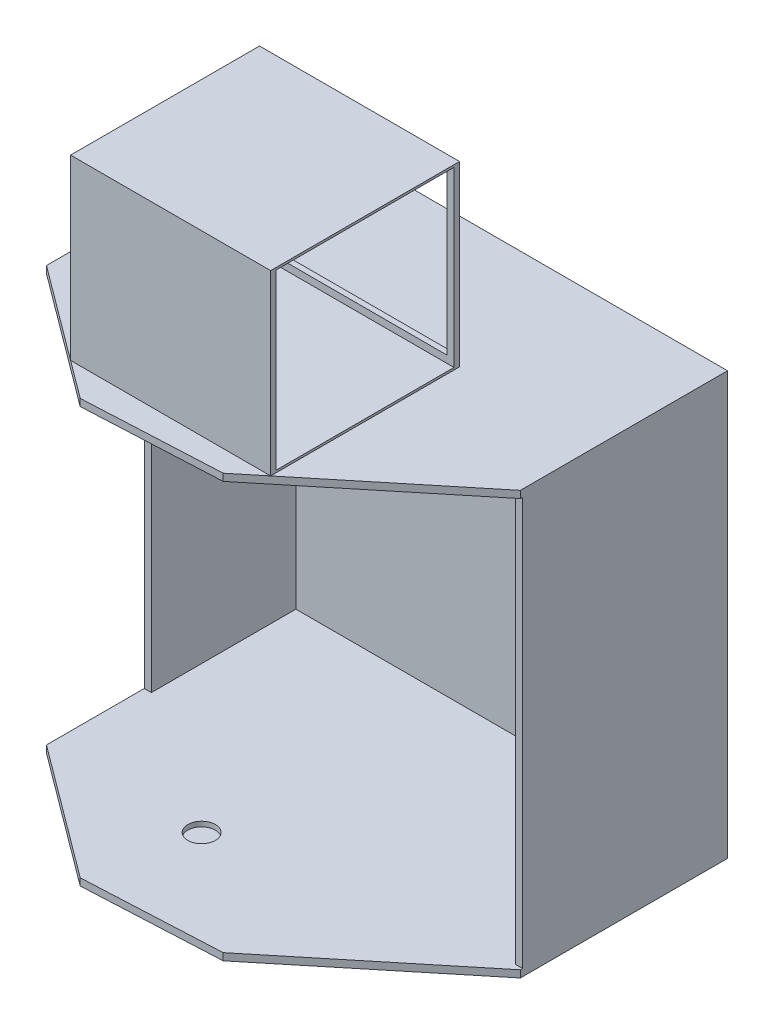
ISO-10303-21;
HEADER;
FILE_DESCRIPTION(('STEP AP214'),'2;1');
FILE_NAME('part.step','',(''),(''),'','','');
FILE_SCHEMA(('AUTOMOTIVE_DESIGN { 1 0 10303 214 1 1 1 1 }'));
ENDSEC;
DATA;
#1=APPLICATION_CONTEXT('core data for automotive mechanical design processes');
#2=APPLICATION_PROTOCOL_DEFINITION('international standard','automotive_design',2000,#1);
#3=PRODUCT_CONTEXT('',#1,'mechanical');
#4=PRODUCT('Part','Part','',(#3));
#5=PRODUCT_RELATED_PRODUCT_CATEGORY('part','',(#4));
#6=PRODUCT_DEFINITION_FORMATION('','',#4);
#7=PRODUCT_DEFINITION_CONTEXT('part definition',#1,'design');
#8=PRODUCT_DEFINITION('design','',#6,#7);
#9=PRODUCT_DEFINITION_SHAPE('','',#8);
#10=(LENGTH_UNIT() NAMED_UNIT(*) SI_UNIT(.MILLI.,.METRE.));
#11=(NAMED_UNIT(*) PLANE_ANGLE_UNIT() SI_UNIT($,.RADIAN.));
#12=(NAMED_UNIT(*) SI_UNIT($,.STERADIAN.) SOLID_ANGLE_UNIT());
#13=UNCERTAINTY_MEASURE_WITH_UNIT(LENGTH_MEASURE(1.E-05),#10,'distance_accuracy_value','');
#14=(GEOMETRIC_REPRESENTATION_CONTEXT(3) GLOBAL_UNCERTAINTY_ASSIGNED_CONTEXT((#13)) GLOBAL_UNIT_ASSIGNED_CONTEXT((#10,
#11,#12)) REPRESENTATION_CONTEXT('',''));
#15=CARTESIAN_POINT('',(0.,0.,0.));
#16=DIRECTION('',(0.,0.,1.));
#17=DIRECTION('',(1.,0.,0.));
#18=AXIS2_PLACEMENT_3D('',#15,#16,#17);
#19=CARTESIAN_POINT('',(0.,190.,0.));
#20=DIRECTION('',(0.,-1.,0.));
#21=DIRECTION('',(0.,0.,-1.));
#22=AXIS2_PLACEMENT_3D('',#19,#20,#21);
#23=PLANE('',#22);
#24=DIRECTION('',(0.,0.,1.));
#25=VECTOR('',#24,1.);
#26=CARTESIAN_POINT('',(-31.9964301301994,190.,55.5581452343));
#27=LINE('',#26,#25);
#28=CARTESIAN_POINT('',(-31.9964301301994,190.,55.5581452343));
#29=VERTEX_POINT('',#28);
#30=CARTESIAN_POINT('',(-31.9964301301994,190.,140.5581452343));
#31=VERTEX_POINT('',#30);
#32=EDGE_CURVE('E283',#29,#31,#27,.T.);
#33=ORIENTED_EDGE('',*,*,#32,.F.);
#34=DIRECTION('',(-1.,0.,0.));
#35=VECTOR('',#34,1.);
#36=CARTESIAN_POINT('',(58.0035698698006,190.,55.5581452343));
#37=LINE('',#36,#35);
#38=CARTESIAN_POINT('',(58.0035698698006,190.,55.5581452343));
#39=VERTEX_POINT('',#38);
#40=EDGE_CURVE('E294',#39,#29,#37,.T.);
#41=ORIENTED_EDGE('',*,*,#40,.F.);
#42=DIRECTION('',(0.,0.,-1.));
#43=VECTOR('',#42,1.);
#44=CARTESIAN_POINT('',(58.0035698698006,190.,140.5581452343));
#45=LINE('',#44,#43);
#46=CARTESIAN_POINT('',(58.0035698698006,190.,140.5581452343));
#47=VERTEX_POINT('',#46);
#48=EDGE_CURVE('E306',#47,#39,#45,.T.);
#49=ORIENTED_EDGE('',*,*,#48,.F.);
#50=DIRECTION('',(0.773976601824276,0.,-0.633214197431285));
#51=VECTOR('',#50,1.);
#52=CARTESIAN_POINT('',(119.800702027798,190.,90.));
#53=LINE('',#52,#51);
#54=CARTESIAN_POINT('',(119.800702027798,190.,90.));
#55=VERTEX_POINT('',#54);
#56=EDGE_CURVE('E346',#47,#55,#53,.T.);
#57=ORIENTED_EDGE('',*,*,#56,.T.);
#58=DIRECTION('',(0.,0.,-1.));
#59=VECTOR('',#58,1.);
#60=CARTESIAN_POINT('',(119.800702027798,190.,89.));
#61=LINE('',#60,#59);
#62=CARTESIAN_POINT('',(119.800702027798,190.,-3.2));
#63=VERTEX_POINT('',#62);
#64=EDGE_CURVE('E393',#55,#63,#61,.T.);
#65=ORIENTED_EDGE('',*,*,#64,.T.);
#66=DIRECTION('',(-1.,0.,0.));
#67=VECTOR('',#66,1.);
#68=CARTESIAN_POINT('',(-74.3992979722016,190.,-3.2));
#69=LINE('',#68,#67);
#70=CARTESIAN_POINT('',(-74.3992979722016,190.,-3.2));
#71=VERTEX_POINT('',#70);
#72=EDGE_CURVE('E337',#63,#71,#69,.T.);
#73=ORIENTED_EDGE('',*,*,#72,.T.);
#74=DIRECTION('',(0.,0.,1.));
#75=VECTOR('',#74,1.);
#76=CARTESIAN_POINT('',(-74.3992979722016,190.,65.));
#77=LINE('',#76,#75);
#78=CARTESIAN_POINT('',(-74.3992979722016,190.,109.));
#79=VERTEX_POINT('',#78);
#80=EDGE_CURVE('E408',#71,#79,#77,.T.);
#81=ORIENTED_EDGE('',*,*,#80,.T.);
#82=DIRECTION('',(0.802210362931271,0.,0.597041483990583));
#83=VECTOR('',#82,1.);
#84=CARTESIAN_POINT('',(-15.0357311152875,190.,153.181069815303));
#85=LINE('',#84,#83);
#86=EDGE_CURVE('E351',#79,#31,#85,.T.);
#87=ORIENTED_EDGE('',*,*,#86,.T.);
#88=EDGE_LOOP('',(#33,#41,#49,#57,#65,#73,#81,#87));
#89=FACE_BOUND('',#88,.T.);
#90=ADVANCED_FACE('F33',(#89),#23,.F.);
#91=DIRECTION('',(1.,0.,0.));
#92=VECTOR('',#91,1.);
#93=CARTESIAN_POINT('',(-31.9964301301994,190.,140.5581452343));
#94=LINE('',#93,#92);
#95=EDGE_CURVE('E303',#31,#47,#94,.T.);
#96=ORIENTED_EDGE('',*,*,#95,.F.);
#97=CARTESIAN_POINT('',(-15.0357311152875,190.,153.181069815303));
#98=VERTEX_POINT('',#97);
#99=EDGE_CURVE('E378',#31,#98,#85,.T.);
#100=ORIENTED_EDGE('',*,*,#99,.T.);
#101=DIRECTION('',(0.998784397084784,0.,-0.0492922726193887));
#102=VECTOR('',#101,1.);
#103=CARTESIAN_POINT('',(46.2729248544923,190.,150.155348755972));
#104=LINE('',#103,#102);
#105=CARTESIAN_POINT('',(46.2729248544923,190.,150.155348755972));
#106=VERTEX_POINT('',#105);
#107=EDGE_CURVE('E375',#98,#106,#104,.T.);
#108=ORIENTED_EDGE('',*,*,#107,.T.);
#109=EDGE_CURVE('E372',#106,#47,#53,.T.);
#110=ORIENTED_EDGE('',*,*,#109,.T.);
#111=EDGE_LOOP('',(#96,#100,#108,#110));
#112=FACE_BOUND('',#111,.T.);
#113=ADVANCED_FACE('F575',(#112),#23,.F.);
#114=CARTESIAN_POINT('',(-71.1992979722016,190.,65.));
#115=DIRECTION('',(0.,0.,-1.));
#116=DIRECTION('',(-1.,0.,0.));
#117=AXIS2_PLACEMENT_3D('',#114,#115,#116);
#118=PLANE('',#117);
#119=DIRECTION('',(-1.,0.,0.));
#120=VECTOR('',#119,1.);
#121=CARTESIAN_POINT('',(-74.3992979722016,186.8,65.));
#122=LINE('',#121,#120);
#123=CARTESIAN_POINT('',(-71.1992979722016,186.8,65.));
#124=VERTEX_POINT('',#123);
#125=CARTESIAN_POINT('',(-74.3992979722016,186.8,65.));
#126=VERTEX_POINT('',#125);
#127=EDGE_CURVE('E368',#124,#126,#122,.T.);
#128=ORIENTED_EDGE('',*,*,#127,.T.);
#129=DIRECTION('',(0.,-1.,0.));
#130=VECTOR('',#129,1.);
#131=CARTESIAN_POINT('',(-74.3992979722016,190.,65.));
#132=LINE('',#131,#130);
#133=CARTESIAN_POINT('',(-74.3992979722016,3.2,65.));
#134=VERTEX_POINT('',#133);
#135=EDGE_CURVE('E410',#126,#134,#132,.T.);
#136=ORIENTED_EDGE('',*,*,#135,.T.);
#137=DIRECTION('',(-1.,0.,0.));
#138=VECTOR('',#137,1.);
#139=CARTESIAN_POINT('',(-74.3992979722016,3.2,65.));
#140=LINE('',#139,#138);
#141=CARTESIAN_POINT('',(-71.1992979722016,3.2,65.));
#142=VERTEX_POINT('',#141);
#143=EDGE_CURVE('E433',#142,#134,#140,.T.);
#144=ORIENTED_EDGE('',*,*,#143,.F.);
#145=DIRECTION('',(0.,-1.,0.));
#146=VECTOR('',#145,1.);
#147=CARTESIAN_POINT('',(-71.1992979722016,190.,65.));
#148=LINE('',#147,#146);
#149=EDGE_CURVE('E414',#124,#142,#148,.T.);
#150=ORIENTED_EDGE('',*,*,#149,.F.);
#151=EDGE_LOOP('',(#128,#136,#144,#150));
#152=FACE_BOUND('',#151,.T.);
#153=ADVANCED_FACE('F501',(#152),#118,.F.);
#154=CARTESIAN_POINT('',(-71.1992979722016,190.,0.));
#155=DIRECTION('',(-1.,0.,0.));
#156=DIRECTION('',(0.,0.,1.));
#157=AXIS2_PLACEMENT_3D('',#154,#155,#156);
#158=PLANE('',#157);
#159=DIRECTION('',(0.,0.,1.));
#160=VECTOR('',#159,1.);
#161=CARTESIAN_POINT('',(-71.1992979722016,186.8,65.));
#162=LINE('',#161,#160);
#163=CARTESIAN_POINT('',(-71.1992979722016,186.8,0.));
#164=VERTEX_POINT('',#163);
#165=EDGE_CURVE('E347',#164,#124,#162,.T.);
#166=ORIENTED_EDGE('',*,*,#165,.T.);
#167=ORIENTED_EDGE('',*,*,#149,.T.);
#168=DIRECTION('',(0.,0.,1.));
#169=VECTOR('',#168,1.);
#170=CARTESIAN_POINT('',(-71.1992979722016,3.2,65.));
#171=LINE('',#170,#169);
#172=CARTESIAN_POINT('',(-71.1992979722016,3.2,0.));
#173=VERTEX_POINT('',#172);
#174=EDGE_CURVE('E430',#173,#142,#171,.T.);
#175=ORIENTED_EDGE('',*,*,#174,.F.);
#176=DIRECTION('',(0.,-1.,0.));
#177=VECTOR('',#176,1.);
#178=CARTESIAN_POINT('',(-71.1992979722016,190.,0.));
#179=LINE('',#178,#177);
#180=EDGE_CURVE('E412',#164,#173,#179,.T.);
#181=ORIENTED_EDGE('',*,*,#180,.F.);
#182=EDGE_LOOP('',(#166,#167,#175,#181));
#183=FACE_BOUND('',#182,.T.);
#184=ADVANCED_FACE('F497',(#183),#158,.F.);
#185=CARTESIAN_POINT('',(116.600702027798,190.,0.));
#186=DIRECTION('',(1.,0.,0.));
#187=DIRECTION('',(0.,0.,-1.));
#188=AXIS2_PLACEMENT_3D('',#185,#186,#187);
#189=PLANE('',#188);
#190=DIRECTION('',(0.,0.,1.));
#191=VECTOR('',#190,1.);
#192=CARTESIAN_POINT('',(116.600702027798,186.8,0.));
#193=LINE('',#192,#191);
#194=CARTESIAN_POINT('',(116.600702027798,186.8,0.));
#195=VERTEX_POINT('',#194);
#196=CARTESIAN_POINT('',(116.600702027798,186.8,89.));
#197=VERTEX_POINT('',#196);
#198=EDGE_CURVE('E391',#195,#197,#193,.T.);
#199=ORIENTED_EDGE('',*,*,#198,.F.);
#200=DIRECTION('',(0.,-1.,0.));
#201=VECTOR('',#200,1.);
#202=CARTESIAN_POINT('',(116.600702027798,190.,0.));
#203=LINE('',#202,#201);
#204=CARTESIAN_POINT('',(116.600702027798,3.2,0.));
#205=VERTEX_POINT('',#204);
#206=EDGE_CURVE('E399',#195,#205,#203,.T.);
#207=ORIENTED_EDGE('',*,*,#206,.T.);
#208=DIRECTION('',(0.,0.,1.));
#209=VECTOR('',#208,1.);
#210=CARTESIAN_POINT('',(116.600702027798,3.2,0.));
#211=LINE('',#210,#209);
#212=CARTESIAN_POINT('',(116.600702027798,3.2,89.));
#213=VERTEX_POINT('',#212);
#214=EDGE_CURVE('E405',#205,#213,#211,.T.);
#215=ORIENTED_EDGE('',*,*,#214,.T.);
#216=DIRECTION('',(0.,-1.,0.));
#217=VECTOR('',#216,1.);
#218=CARTESIAN_POINT('',(116.600702027798,190.,89.));
#219=LINE('',#218,#217);
#220=EDGE_CURVE('E397',#197,#213,#219,.T.);
#221=ORIENTED_EDGE('',*,*,#220,.F.);
#222=EDGE_LOOP('',(#199,#207,#215,#221));
#223=FACE_BOUND('',#222,.T.);
#224=ADVANCED_FACE('F489',(#223),#189,.F.);
#225=CARTESIAN_POINT('',(116.600702027798,190.,89.));
#226=DIRECTION('',(0.,0.,-1.));
#227=DIRECTION('',(-1.,0.,0.));
#228=AXIS2_PLACEMENT_3D('',#225,#226,#227);
#229=PLANE('',#228);
#230=DIRECTION('',(1.,0.,0.));
#231=VECTOR('',#230,1.);
#232=CARTESIAN_POINT('',(116.600702027798,186.8,89.));
#233=LINE('',#232,#231);
#234=CARTESIAN_POINT('',(119.800702027798,186.8,89.));
#235=VERTEX_POINT('',#234);
#236=EDGE_CURVE('E42',#197,#235,#233,.T.);
#237=ORIENTED_EDGE('',*,*,#236,.F.);
#238=ORIENTED_EDGE('',*,*,#220,.T.);
#239=DIRECTION('',(1.,0.,0.));
#240=VECTOR('',#239,1.);
#241=CARTESIAN_POINT('',(0.,3.2,89.));
#242=LINE('',#241,#240);
#243=CARTESIAN_POINT('',(119.800702027798,3.20000000000001,89.));
#244=VERTEX_POINT('',#243);
#245=EDGE_CURVE('E402',#213,#244,#242,.T.);
#246=ORIENTED_EDGE('',*,*,#245,.T.);
#247=DIRECTION('',(0.,-1.,0.));
#248=VECTOR('',#247,1.);
#249=CARTESIAN_POINT('',(119.800702027798,190.,89.));
#250=LINE('',#249,#248);
#251=EDGE_CURVE('E395',#235,#244,#250,.T.);
#252=ORIENTED_EDGE('',*,*,#251,.F.);
#253=EDGE_LOOP('',(#237,#238,#246,#252));
#254=FACE_BOUND('',#253,.T.);
#255=ADVANCED_FACE('F483',(#254),#229,.F.);
#256=CARTESIAN_POINT('',(0.,3.2,0.));
#257=DIRECTION('',(0.,-1.,0.));
#258=DIRECTION('',(0.,0.,-1.));
#259=AXIS2_PLACEMENT_3D('',#256,#257,#258);
#260=PLANE('',#259);
#261=CARTESIAN_POINT('',(-5.39929797220156,3.2,108.199281836625));
#262=DIRECTION('',(0.,-1.,0.));
#263=DIRECTION('',(0.,0.,-1.));
#264=AXIS2_PLACEMENT_3D('',#261,#262,#263);
#265=CIRCLE('',#264,6.2);
#266=CARTESIAN_POINT('',(-5.39929797220156,3.2,101.999281836625));
#267=VERTEX_POINT('',#266);
#268=EDGE_CURVE('E331',#267,#267,#265,.T.);
#269=ORIENTED_EDGE('',*,*,#268,.T.);
#270=EDGE_LOOP('',(#269));
#271=FACE_BOUND('',#270,.T.);
#272=ORIENTED_EDGE('',*,*,#214,.F.);
#273=DIRECTION('',(-1.,0.,0.));
#274=VECTOR('',#273,1.);
#275=CARTESIAN_POINT('',(-71.1992979722016,3.2,0.));
#276=LINE('',#275,#274);
#277=EDGE_CURVE('E448',#205,#173,#276,.T.);
#278=ORIENTED_EDGE('',*,*,#277,.T.);
#279=ORIENTED_EDGE('',*,*,#174,.T.);
#280=ORIENTED_EDGE('',*,*,#143,.T.);
#281=DIRECTION('',(0.,0.,1.));
#282=VECTOR('',#281,1.);
#283=CARTESIAN_POINT('',(-74.3992979722016,3.2,109.));
#284=LINE('',#283,#282);
#285=CARTESIAN_POINT('',(-74.3992979722016,3.2,109.));
#286=VERTEX_POINT('',#285);
#287=EDGE_CURVE('E437',#134,#286,#284,.T.);
#288=ORIENTED_EDGE('',*,*,#287,.T.);
#289=DIRECTION('',(0.802210362931271,0.,0.597041483990583));
#290=VECTOR('',#289,1.);
#291=CARTESIAN_POINT('',(-15.0357311152875,3.2,153.181069815303));
#292=LINE('',#291,#290);
#293=CARTESIAN_POINT('',(-15.0357311152875,3.2,153.181069815303));
#294=VERTEX_POINT('',#293);
#295=EDGE_CURVE('E439',#286,#294,#292,.T.);
#296=ORIENTED_EDGE('',*,*,#295,.T.);
#297=DIRECTION('',(0.998784397084784,0.,-0.0492922726193887));
#298=VECTOR('',#297,1.);
#299=CARTESIAN_POINT('',(46.2729248544923,3.2,150.155348755972));
#300=LINE('',#299,#298);
#301=CARTESIAN_POINT('',(46.2729248544923,3.2,150.155348755972));
#302=VERTEX_POINT('',#301);
#303=EDGE_CURVE('E441',#294,#302,#300,.T.);
#304=ORIENTED_EDGE('',*,*,#303,.T.);
#305=DIRECTION('',(0.773976601824276,0.,-0.633214197431285));
#306=VECTOR('',#305,1.);
#307=CARTESIAN_POINT('',(119.800702027798,3.2,90.));
#308=LINE('',#307,#306);
#309=CARTESIAN_POINT('',(119.800702027798,3.2,90.));
#310=VERTEX_POINT('',#309);
#311=EDGE_CURVE('E443',#302,#310,#308,.T.);
#312=ORIENTED_EDGE('',*,*,#311,.T.);
#313=DIRECTION('',(0.,0.,-1.));
#314=VECTOR('',#313,1.);
#315=CARTESIAN_POINT('',(119.800702027798,3.2,0.));
#316=LINE('',#315,#314);
#317=EDGE_CURVE('E445',#310,#244,#316,.T.);
#318=ORIENTED_EDGE('',*,*,#317,.T.);
#319=ORIENTED_EDGE('',*,*,#245,.F.);
#320=EDGE_LOOP('',(#272,#278,#279,#280,#288,#296,#304,#312,#318,#319));
#321=FACE_BOUND('',#320,.T.);
#322=ADVANCED_FACE('F487',(#271,#321),#260,.F.);
#323=CARTESIAN_POINT('',(-74.3992979722016,3.2,109.));
#324=DIRECTION('',(1.,0.,0.));
#325=DIRECTION('',(0.,0.,-1.));
#326=AXIS2_PLACEMENT_3D('',#323,#324,#325);
#327=PLANE('',#326);
#328=DIRECTION('',(0.,0.,1.));
#329=VECTOR('',#328,1.);
#330=CARTESIAN_POINT('',(-74.3992979722016,0.,109.));
#331=LINE('',#330,#329);
#332=CARTESIAN_POINT('',(-74.3992979722016,0.,-3.2));
#333=VERTEX_POINT('',#332);
#334=CARTESIAN_POINT('',(-74.3992979722016,0.,109.));
#335=VERTEX_POINT('',#334);
#336=EDGE_CURVE('E427',#333,#335,#331,.T.);
#337=ORIENTED_EDGE('',*,*,#336,.T.);
#338=DIRECTION('',(0.,-1.,0.));
#339=VECTOR('',#338,1.);
#340=CARTESIAN_POINT('',(-74.3992979722016,3.2,109.));
#341=LINE('',#340,#339);
#342=EDGE_CURVE('E423',#286,#335,#341,.T.);
#343=ORIENTED_EDGE('',*,*,#342,.F.);
#344=ORIENTED_EDGE('',*,*,#287,.F.);
#345=ORIENTED_EDGE('',*,*,#135,.F.);
#346=DIRECTION('',(0.,0.,1.));
#347=VECTOR('',#346,1.);
#348=CARTESIAN_POINT('',(-74.3992979722016,186.8,109.));
#349=LINE('',#348,#347);
#350=CARTESIAN_POINT('',(-74.3992979722016,186.8,109.));
#351=VERTEX_POINT('',#350);
#352=EDGE_CURVE('E365',#126,#351,#349,.T.);
#353=ORIENTED_EDGE('',*,*,#352,.T.);
#354=DIRECTION('',(0.,1.,0.));
#355=VECTOR('',#354,1.);
#356=CARTESIAN_POINT('',(-74.3992979722016,186.8,109.));
#357=LINE('',#356,#355);
#358=EDGE_CURVE('E371',#351,#79,#357,.T.);
#359=ORIENTED_EDGE('',*,*,#358,.T.);
#360=ORIENTED_EDGE('',*,*,#80,.F.);
#361=DIRECTION('',(0.,-1.,0.));
#362=VECTOR('',#361,1.);
#363=CARTESIAN_POINT('',(-74.3992979722016,0.,-3.2));
#364=LINE('',#363,#362);
#365=EDGE_CURVE('E340',#71,#333,#364,.T.);
#366=ORIENTED_EDGE('',*,*,#365,.T.);
#367=EDGE_LOOP('',(#337,#343,#344,#345,#353,#359,#360,#366));
#368=FACE_BOUND('',#367,.T.);
#369=ADVANCED_FACE('F35',(#368),#327,.F.);
#370=CARTESIAN_POINT('',(-15.0357311152875,3.2,153.181069815303));
#371=DIRECTION('',(0.597041483990583,0.,-0.802210362931271));
#372=DIRECTION('',(-0.802210362931272,0.,-0.597041483990583));
#373=AXIS2_PLACEMENT_3D('',#370,#371,#372);
#374=PLANE('',#373);
#375=DIRECTION('',(0.802210362931271,0.,0.597041483990583));
#376=VECTOR('',#375,1.);
#377=CARTESIAN_POINT('',(-15.0357311152875,0.,153.181069815303));
#378=LINE('',#377,#376);
#379=CARTESIAN_POINT('',(-15.0357311152875,0.,153.181069815303));
#380=VERTEX_POINT('',#379);
#381=EDGE_CURVE('E453',#335,#380,#378,.T.);
#382=ORIENTED_EDGE('',*,*,#381,.T.);
#383=DIRECTION('',(0.,-1.,0.));
#384=VECTOR('',#383,1.);
#385=CARTESIAN_POINT('',(-15.0357311152875,3.2,153.181069815303));
#386=LINE('',#385,#384);
#387=EDGE_CURVE('E465',#294,#380,#386,.T.);
#388=ORIENTED_EDGE('',*,*,#387,.F.);
#389=ORIENTED_EDGE('',*,*,#295,.F.);
#390=ORIENTED_EDGE('',*,*,#342,.T.);
#391=EDGE_LOOP('',(#382,#388,#389,#390));
#392=FACE_BOUND('',#391,.T.);
#393=ADVANCED_FACE('F510',(#392),#374,.F.);
#394=CARTESIAN_POINT('',(46.2729248544923,3.2,150.155348755972));
#395=DIRECTION('',(-0.0492922726193887,0.,-0.998784397084784));
#396=DIRECTION('',(-0.998784397084784,0.,0.0492922726193887));
#397=AXIS2_PLACEMENT_3D('',#394,#395,#396);
#398=PLANE('',#397);
#399=DIRECTION('',(0.998784397084784,0.,-0.0492922726193887));
#400=VECTOR('',#399,1.);
#401=CARTESIAN_POINT('',(46.2729248544923,0.,150.155348755972));
#402=LINE('',#401,#400);
#403=CARTESIAN_POINT('',(46.2729248544923,0.,150.155348755972));
#404=VERTEX_POINT('',#403);
#405=EDGE_CURVE('E455',#380,#404,#402,.T.);
#406=ORIENTED_EDGE('',*,*,#405,.T.);
#407=DIRECTION('',(0.,-1.,0.));
#408=VECTOR('',#407,1.);
#409=CARTESIAN_POINT('',(46.2729248544923,3.2,150.155348755972));
#410=LINE('',#409,#408);
#411=EDGE_CURVE('E462',#302,#404,#410,.T.);
#412=ORIENTED_EDGE('',*,*,#411,.F.);
#413=ORIENTED_EDGE('',*,*,#303,.F.);
#414=ORIENTED_EDGE('',*,*,#387,.T.);
#415=EDGE_LOOP('',(#406,#412,#413,#414));
#416=FACE_BOUND('',#415,.T.);
#417=ADVANCED_FACE('F514',(#416),#398,.F.);
#418=CARTESIAN_POINT('',(119.800702027798,3.2,90.));
#419=DIRECTION('',(-0.633214197431285,0.,-0.773976601824276));
#420=DIRECTION('',(-0.773976601824276,0.,0.633214197431285));
#421=AXIS2_PLACEMENT_3D('',#418,#419,#420);
#422=PLANE('',#421);
#423=DIRECTION('',(0.773976601824276,0.,-0.633214197431285));
#424=VECTOR('',#423,1.);
#425=CARTESIAN_POINT('',(119.800702027798,0.,90.));
#426=LINE('',#425,#424);
#427=CARTESIAN_POINT('',(119.800702027798,0.,90.));
#428=VERTEX_POINT('',#427);
#429=EDGE_CURVE('E457',#404,#428,#426,.T.);
#430=ORIENTED_EDGE('',*,*,#429,.T.);
#431=DIRECTION('',(0.,-1.,0.));
#432=VECTOR('',#431,1.);
#433=CARTESIAN_POINT('',(119.800702027798,3.2,90.));
#434=LINE('',#433,#432);
#435=EDGE_CURVE('E451',#310,#428,#434,.T.);
#436=ORIENTED_EDGE('',*,*,#435,.F.);
#437=ORIENTED_EDGE('',*,*,#311,.F.);
#438=ORIENTED_EDGE('',*,*,#411,.T.);
#439=EDGE_LOOP('',(#430,#436,#437,#438));
#440=FACE_BOUND('',#439,.T.);
#441=ADVANCED_FACE('F519',(#440),#422,.F.);
#442=CARTESIAN_POINT('',(119.800702027798,3.2,0.));
#443=DIRECTION('',(-1.,0.,0.));
#444=DIRECTION('',(0.,0.,1.));
#445=AXIS2_PLACEMENT_3D('',#442,#443,#444);
#446=PLANE('',#445);
#447=ORIENTED_EDGE('',*,*,#64,.F.);
#448=DIRECTION('',(0.,1.,0.));
#449=VECTOR('',#448,1.);
#450=CARTESIAN_POINT('',(119.800702027798,186.8,90.));
#451=LINE('',#450,#449);
#452=CARTESIAN_POINT('',(119.800702027798,186.8,90.));
#453=VERTEX_POINT('',#452);
#454=EDGE_CURVE('E388',#453,#55,#451,.T.);
#455=ORIENTED_EDGE('',*,*,#454,.F.);
#456=DIRECTION('',(0.,0.,-1.));
#457=VECTOR('',#456,1.);
#458=CARTESIAN_POINT('',(119.800702027798,186.8,0.));
#459=LINE('',#458,#457);
#460=EDGE_CURVE('E353',#453,#235,#459,.T.);
#461=ORIENTED_EDGE('',*,*,#460,.T.);
#462=ORIENTED_EDGE('',*,*,#251,.T.);
#463=ORIENTED_EDGE('',*,*,#317,.F.);
#464=ORIENTED_EDGE('',*,*,#435,.T.);
#465=DIRECTION('',(0.,0.,-1.));
#466=VECTOR('',#465,1.);
#467=CARTESIAN_POINT('',(119.800702027798,0.,0.));
#468=LINE('',#467,#466);
#469=CARTESIAN_POINT('',(119.800702027798,0.,-3.2));
#470=VERTEX_POINT('',#469);
#471=EDGE_CURVE('E434',#428,#470,#468,.T.);
#472=ORIENTED_EDGE('',*,*,#471,.T.);
#473=DIRECTION('',(0.,1.,0.));
#474=VECTOR('',#473,1.);
#475=CARTESIAN_POINT('',(119.800702027798,0.,-3.2));
#476=LINE('',#475,#474);
#477=EDGE_CURVE('E334',#470,#63,#476,.T.);
#478=ORIENTED_EDGE('',*,*,#477,.T.);
#479=EDGE_LOOP('',(#447,#455,#461,#462,#463,#464,#472,#478));
#480=FACE_BOUND('',#479,.T.);
#481=ADVANCED_FACE('F481',(#480),#446,.F.);
#482=CARTESIAN_POINT('',(0.,0.,0.));
#483=DIRECTION('',(0.,-1.,0.));
#484=DIRECTION('',(0.,0.,-1.));
#485=AXIS2_PLACEMENT_3D('',#482,#483,#484);
#486=PLANE('',#485);
#487=ORIENTED_EDGE('',*,*,#336,.F.);
#488=DIRECTION('',(1.,0.,0.));
#489=VECTOR('',#488,1.);
#490=CARTESIAN_POINT('',(-74.3992979722016,0.,-3.2));
#491=LINE('',#490,#489);
#492=EDGE_CURVE('E343',#333,#470,#491,.T.);
#493=ORIENTED_EDGE('',*,*,#492,.T.);
#494=ORIENTED_EDGE('',*,*,#471,.F.);
#495=ORIENTED_EDGE('',*,*,#429,.F.);
#496=ORIENTED_EDGE('',*,*,#405,.F.);
#497=ORIENTED_EDGE('',*,*,#381,.F.);
#498=EDGE_LOOP('',(#487,#493,#494,#495,#496,#497));
#499=FACE_BOUND('',#498,.T.);
#500=CARTESIAN_POINT('',(-5.39929797220156,0.,108.199281836625));
#501=DIRECTION('',(0.,-1.,0.));
#502=DIRECTION('',(0.,0.,-1.));
#503=AXIS2_PLACEMENT_3D('',#500,#501,#502);
#504=CIRCLE('',#503,12.3);
#505=CARTESIAN_POINT('',(-5.39929797220156,0.,95.8992818366245));
#506=VERTEX_POINT('',#505);
#507=EDGE_CURVE('E419',#506,#506,#504,.T.);
#508=ORIENTED_EDGE('',*,*,#507,.F.);
#509=EDGE_LOOP('',(#508));
#510=FACE_BOUND('',#509,.T.);
#511=ADVANCED_FACE('F523',(#499,#510),#486,.T.);
#512=CARTESIAN_POINT('',(-5.39929797220156,-3.2,108.199281836625));
#513=DIRECTION('',(0.,1.,0.));
#514=DIRECTION('',(0.,0.,1.));
#515=AXIS2_PLACEMENT_3D('',#512,#513,#514);
#516=CYLINDRICAL_SURFACE('',#515,12.3);
#517=CARTESIAN_POINT('',(-5.39929797220156,-3.2,108.199281836625));
#518=DIRECTION('',(0.,-1.,0.));
#519=DIRECTION('',(0.,0.,-1.));
#520=AXIS2_PLACEMENT_3D('',#517,#518,#519);
#521=CIRCLE('',#520,12.3);
#522=CARTESIAN_POINT('',(-5.39929797220156,-3.2,95.8992818366245));
#523=VERTEX_POINT('',#522);
#524=EDGE_CURVE('E424',#523,#523,#521,.T.);
#525=ORIENTED_EDGE('',*,*,#524,.F.);
#526=EDGE_LOOP('',(#525));
#527=FACE_BOUND('',#526,.T.);
#528=ORIENTED_EDGE('',*,*,#507,.T.);
#529=EDGE_LOOP('',(#528));
#530=FACE_BOUND('',#529,.T.);
#531=ADVANCED_FACE('F600',(#527,#530),#516,.T.);
#532=CARTESIAN_POINT('',(-5.39929797220156,-3.2,108.199281836625));
#533=DIRECTION('',(0.,-1.,0.));
#534=DIRECTION('',(0.,0.,-1.));
#535=AXIS2_PLACEMENT_3D('',#532,#533,#534);
#536=PLANE('',#535);
#537=CARTESIAN_POINT('',(-5.39929797220156,-3.2,108.199281836625));
#538=DIRECTION('',(0.,-1.,0.));
#539=DIRECTION('',(0.,0.,-1.));
#540=AXIS2_PLACEMENT_3D('',#537,#538,#539);
#541=CIRCLE('',#540,4.);
#542=CARTESIAN_POINT('',(-5.39929797220156,-3.2,104.199281836625));
#543=VERTEX_POINT('',#542);
#544=EDGE_CURVE('E420',#543,#543,#541,.T.);
#545=ORIENTED_EDGE('',*,*,#544,.F.);
#546=EDGE_LOOP('',(#545));
#547=FACE_BOUND('',#546,.T.);
#548=ORIENTED_EDGE('',*,*,#524,.T.);
#549=EDGE_LOOP('',(#548));
#550=FACE_BOUND('',#549,.T.);
#551=ADVANCED_FACE('F596',(#547,#550),#536,.T.);
#552=CARTESIAN_POINT('',(-5.39929797220156,-7.2,108.199281836625));
#553=DIRECTION('',(0.,1.,0.));
#554=DIRECTION('',(0.,0.,1.));
#555=AXIS2_PLACEMENT_3D('',#552,#553,#554);
#556=CYLINDRICAL_SURFACE('',#555,4.);
#557=CARTESIAN_POINT('',(-5.39929797220156,-7.2,108.199281836625));
#558=DIRECTION('',(0.,-1.,0.));
#559=DIRECTION('',(0.,0.,-1.));
#560=AXIS2_PLACEMENT_3D('',#557,#558,#559);
#561=CIRCLE('',#560,4.);
#562=CARTESIAN_POINT('',(-5.39929797220156,-7.2,104.199281836625));
#563=VERTEX_POINT('',#562);
#564=EDGE_CURVE('E416',#563,#563,#561,.T.);
#565=ORIENTED_EDGE('',*,*,#564,.F.);
#566=EDGE_LOOP('',(#565));
#567=FACE_BOUND('',#566,.T.);
#568=ORIENTED_EDGE('',*,*,#544,.T.);
#569=EDGE_LOOP('',(#568));
#570=FACE_BOUND('',#569,.T.);
#571=ADVANCED_FACE('F592',(#567,#570),#556,.T.);
#572=CARTESIAN_POINT('',(-5.39929797220156,-7.2,108.199281836625));
#573=DIRECTION('',(0.,-1.,0.));
#574=DIRECTION('',(0.,0.,-1.));
#575=AXIS2_PLACEMENT_3D('',#572,#573,#574);
#576=PLANE('',#575);
#577=ORIENTED_EDGE('',*,*,#564,.T.);
#578=EDGE_LOOP('',(#577));
#579=FACE_BOUND('',#578,.T.);
#580=ADVANCED_FACE('F589',(#579),#576,.T.);
#581=CARTESIAN_POINT('',(0.,186.8,0.));
#582=DIRECTION('',(0.,1.,0.));
#583=DIRECTION('',(0.,0.,-1.));
#584=AXIS2_PLACEMENT_3D('',#581,#582,#583);
#585=PLANE('',#584);
#586=CARTESIAN_POINT('',(-5.39929797220156,186.8,108.199281836625));
#587=DIRECTION('',(0.,1.,0.));
#588=DIRECTION('',(0.,0.,1.));
#589=AXIS2_PLACEMENT_3D('',#586,#587,#588);
#590=CIRCLE('',#589,6.2);
#591=CARTESIAN_POINT('',(-5.39929797220156,186.8,114.399281836625));
#592=VERTEX_POINT('',#591);
#593=EDGE_CURVE('E37',#592,#592,#590,.T.);
#594=ORIENTED_EDGE('',*,*,#593,.T.);
#595=EDGE_LOOP('',(#594));
#596=FACE_BOUND('',#595,.T.);
#597=DIRECTION('',(-1.,0.,0.));
#598=VECTOR('',#597,1.);
#599=CARTESIAN_POINT('',(-71.1992979722016,186.8,0.));
#600=LINE('',#599,#598);
#601=EDGE_CURVE('E350',#195,#164,#600,.T.);
#602=ORIENTED_EDGE('',*,*,#601,.F.);
#603=ORIENTED_EDGE('',*,*,#198,.T.);
#604=ORIENTED_EDGE('',*,*,#236,.T.);
#605=ORIENTED_EDGE('',*,*,#460,.F.);
#606=DIRECTION('',(0.773976601824276,0.,-0.633214197431285));
#607=VECTOR('',#606,1.);
#608=CARTESIAN_POINT('',(119.800702027798,186.8,90.));
#609=LINE('',#608,#607);
#610=CARTESIAN_POINT('',(46.2729248544923,186.8,150.155348755972));
#611=VERTEX_POINT('',#610);
#612=EDGE_CURVE('E356',#611,#453,#609,.T.);
#613=ORIENTED_EDGE('',*,*,#612,.F.);
#614=DIRECTION('',(0.998784397084784,0.,-0.0492922726193887));
#615=VECTOR('',#614,1.);
#616=CARTESIAN_POINT('',(46.2729248544923,186.8,150.155348755972));
#617=LINE('',#616,#615);
#618=CARTESIAN_POINT('',(-15.0357311152875,186.8,153.181069815303));
#619=VERTEX_POINT('',#618);
#620=EDGE_CURVE('E359',#619,#611,#617,.T.);
#621=ORIENTED_EDGE('',*,*,#620,.F.);
#622=DIRECTION('',(0.802210362931271,0.,0.597041483990583));
#623=VECTOR('',#622,1.);
#624=CARTESIAN_POINT('',(-15.0357311152875,186.8,153.181069815303));
#625=LINE('',#624,#623);
#626=EDGE_CURVE('E362',#351,#619,#625,.T.);
#627=ORIENTED_EDGE('',*,*,#626,.F.);
#628=ORIENTED_EDGE('',*,*,#352,.F.);
#629=ORIENTED_EDGE('',*,*,#127,.F.);
#630=ORIENTED_EDGE('',*,*,#165,.F.);
#631=EDGE_LOOP('',(#602,#603,#604,#605,#613,#621,#627,#628,#629,#630));
#632=FACE_BOUND('',#631,.T.);
#633=ADVANCED_FACE('F473',(#596,#632),#585,.F.);
#634=CARTESIAN_POINT('',(119.800702027798,186.8,90.));
#635=DIRECTION('',(0.633214197431285,0.,0.773976601824276));
#636=DIRECTION('',(0.773976601824276,0.,-0.633214197431285));
#637=AXIS2_PLACEMENT_3D('',#634,#635,#636);
#638=PLANE('',#637);
#639=ORIENTED_EDGE('',*,*,#109,.F.);
#640=DIRECTION('',(0.,1.,0.));
#641=VECTOR('',#640,1.);
#642=CARTESIAN_POINT('',(46.2729248544923,186.8,150.155348755972));
#643=LINE('',#642,#641);
#644=EDGE_CURVE('E386',#611,#106,#643,.T.);
#645=ORIENTED_EDGE('',*,*,#644,.F.);
#646=ORIENTED_EDGE('',*,*,#612,.T.);
#647=ORIENTED_EDGE('',*,*,#454,.T.);
#648=ORIENTED_EDGE('',*,*,#56,.F.);
#649=EDGE_LOOP('',(#639,#645,#646,#647,#648));
#650=FACE_BOUND('',#649,.T.);
#651=ADVANCED_FACE('F534',(#650),#638,.T.);
#652=CARTESIAN_POINT('',(46.2729248544923,186.8,150.155348755972));
#653=DIRECTION('',(0.0492922726193887,0.,0.998784397084784));
#654=DIRECTION('',(0.998784397084784,0.,-0.0492922726193887));
#655=AXIS2_PLACEMENT_3D('',#652,#653,#654);
#656=PLANE('',#655);
#657=ORIENTED_EDGE('',*,*,#107,.F.);
#658=DIRECTION('',(0.,1.,0.));
#659=VECTOR('',#658,1.);
#660=CARTESIAN_POINT('',(-15.0357311152875,186.8,153.181069815303));
#661=LINE('',#660,#659);
#662=EDGE_CURVE('E383',#619,#98,#661,.T.);
#663=ORIENTED_EDGE('',*,*,#662,.F.);
#664=ORIENTED_EDGE('',*,*,#620,.T.);
#665=ORIENTED_EDGE('',*,*,#644,.T.);
#666=EDGE_LOOP('',(#657,#663,#664,#665));
#667=FACE_BOUND('',#666,.T.);
#668=ADVANCED_FACE('F539',(#667),#656,.T.);
#669=CARTESIAN_POINT('',(-15.0357311152875,186.8,153.181069815303));
#670=DIRECTION('',(-0.597041483990583,0.,0.802210362931271));
#671=DIRECTION('',(0.802210362931272,0.,0.597041483990583));
#672=AXIS2_PLACEMENT_3D('',#669,#670,#671);
#673=PLANE('',#672);
#674=ORIENTED_EDGE('',*,*,#86,.F.);
#675=ORIENTED_EDGE('',*,*,#358,.F.);
#676=ORIENTED_EDGE('',*,*,#626,.T.);
#677=ORIENTED_EDGE('',*,*,#662,.T.);
#678=ORIENTED_EDGE('',*,*,#99,.F.);
#679=EDGE_LOOP('',(#674,#675,#676,#677,#678));
#680=FACE_BOUND('',#679,.T.);
#681=ADVANCED_FACE('F543',(#680),#673,.T.);
#682=CARTESIAN_POINT('',(0.,0.,0.));
#683=DIRECTION('',(0.,0.,-1.));
#684=DIRECTION('',(-1.,0.,0.));
#685=AXIS2_PLACEMENT_3D('',#682,#683,#684);
#686=PLANE('',#685);
#687=ORIENTED_EDGE('',*,*,#206,.F.);
#688=ORIENTED_EDGE('',*,*,#601,.T.);
#689=ORIENTED_EDGE('',*,*,#180,.T.);
#690=ORIENTED_EDGE('',*,*,#277,.F.);
#691=EDGE_LOOP('',(#687,#688,#689,#690));
#692=FACE_BOUND('',#691,.T.);
#693=ADVANCED_FACE('F491',(#692),#686,.F.);
#694=CARTESIAN_POINT('',(0.,0.,-3.2));
#695=DIRECTION('',(0.,0.,-1.));
#696=DIRECTION('',(-1.,0.,0.));
#697=AXIS2_PLACEMENT_3D('',#694,#695,#696);
#698=PLANE('',#697);
#699=CARTESIAN_POINT('',(22.7007020277984,95.,-3.2));
#700=DIRECTION('',(0.,0.,-1.));
#701=DIRECTION('',(-1.,0.,0.));
#702=AXIS2_PLACEMENT_3D('',#699,#700,#701);
#703=CIRCLE('',#702,35.);
#704=CARTESIAN_POINT('',(-12.2992979722016,95.,-3.2));
#705=VERTEX_POINT('',#704);
#706=EDGE_CURVE('E11',#705,#705,#703,.T.);
#707=ORIENTED_EDGE('',*,*,#706,.F.);
#708=EDGE_LOOP('',(#707));
#709=FACE_BOUND('',#708,.T.);
#710=ORIENTED_EDGE('',*,*,#477,.F.);
#711=ORIENTED_EDGE('',*,*,#492,.F.);
#712=ORIENTED_EDGE('',*,*,#365,.F.);
#713=ORIENTED_EDGE('',*,*,#72,.F.);
#714=EDGE_LOOP('',(#710,#711,#712,#713));
#715=FACE_BOUND('',#714,.T.);
#716=ADVANCED_FACE('F528',(#709,#715),#698,.T.);
#717=CARTESIAN_POINT('',(-5.39929797220156,189.,108.199281836625));
#718=DIRECTION('',(0.,1.,0.));
#719=DIRECTION('',(0.,0.,1.));
#720=AXIS2_PLACEMENT_3D('',#717,#718,#719);
#721=PLANE('',#720);
#722=CARTESIAN_POINT('',(-5.39929797220156,189.,108.199281836625));
#723=DIRECTION('',(0.,1.,0.));
#724=DIRECTION('',(0.,0.,1.));
#725=AXIS2_PLACEMENT_3D('',#722,#723,#724);
#726=CIRCLE('',#725,6.2);
#727=CARTESIAN_POINT('',(-5.39929797220156,189.,114.399281836625));
#728=VERTEX_POINT('',#727);
#729=EDGE_CURVE('E324',#728,#728,#726,.T.);
#730=ORIENTED_EDGE('',*,*,#729,.F.);
#731=EDGE_LOOP('',(#730));
#732=FACE_BOUND('',#731,.T.);
#733=ADVANCED_FACE('F772',(#732),#721,.F.);
#734=CARTESIAN_POINT('',(-5.39929797220156,1.,108.199281836625));
#735=DIRECTION('',(0.,1.,0.));
#736=DIRECTION('',(0.,0.,1.));
#737=AXIS2_PLACEMENT_3D('',#734,#735,#736);
#738=CYLINDRICAL_SURFACE('',#737,6.2);
#739=ORIENTED_EDGE('',*,*,#729,.T.);
#740=EDGE_LOOP('',(#739));
#741=FACE_BOUND('',#740,.T.);
#742=ORIENTED_EDGE('',*,*,#593,.F.);
#743=EDGE_LOOP('',(#742));
#744=FACE_BOUND('',#743,.T.);
#745=ADVANCED_FACE('F781',(#741,#744),#738,.F.);
#746=CARTESIAN_POINT('',(-5.39929797220156,1.,108.199281836625));
#747=DIRECTION('',(0.,1.,0.));
#748=DIRECTION('',(0.,0.,1.));
#749=AXIS2_PLACEMENT_3D('',#746,#747,#748);
#750=CIRCLE('',#749,6.2);
#751=CARTESIAN_POINT('',(-5.39929797220156,1.,114.399281836625));
#752=VERTEX_POINT('',#751);
#753=EDGE_CURVE('E326',#752,#752,#750,.T.);
#754=ORIENTED_EDGE('',*,*,#753,.F.);
#755=EDGE_LOOP('',(#754));
#756=FACE_BOUND('',#755,.T.);
#757=ORIENTED_EDGE('',*,*,#268,.F.);
#758=EDGE_LOOP('',(#757));
#759=FACE_BOUND('',#758,.T.);
#760=ADVANCED_FACE('F789',(#756,#759),#738,.F.);
#761=CARTESIAN_POINT('',(-5.39929797220156,1.,108.199281836625));
#762=DIRECTION('',(0.,1.,0.));
#763=DIRECTION('',(0.,0.,1.));
#764=AXIS2_PLACEMENT_3D('',#761,#762,#763);
#765=PLANE('',#764);
#766=ORIENTED_EDGE('',*,*,#753,.T.);
#767=EDGE_LOOP('',(#766));
#768=FACE_BOUND('',#767,.T.);
#769=ADVANCED_FACE('F797',(#768),#765,.T.);
#770=CARTESIAN_POINT('',(22.7007020277984,95.,-23.2));
#771=DIRECTION('',(0.,0.,1.));
#772=DIRECTION('',(1.,0.,0.));
#773=AXIS2_PLACEMENT_3D('',#770,#771,#772);
#774=CYLINDRICAL_SURFACE('',#773,35.);
#775=CARTESIAN_POINT('',(22.7007020277984,95.,-23.2));
#776=DIRECTION('',(0.,0.,-1.));
#777=DIRECTION('',(-1.,0.,0.));
#778=AXIS2_PLACEMENT_3D('',#775,#776,#777);
#779=CIRCLE('',#778,35.);
#780=CARTESIAN_POINT('',(-12.2992979722016,95.,-23.2));
#781=VERTEX_POINT('',#780);
#782=EDGE_CURVE('E322',#781,#781,#779,.T.);
#783=ORIENTED_EDGE('',*,*,#782,.F.);
#784=EDGE_LOOP('',(#783));
#785=FACE_BOUND('',#784,.T.);
#786=ORIENTED_EDGE('',*,*,#706,.T.);
#787=EDGE_LOOP('',(#786));
#788=FACE_BOUND('',#787,.T.);
#789=ADVANCED_FACE('F803',(#785,#788),#774,.T.);
#790=CARTESIAN_POINT('',(22.7007020277984,95.,-23.2));
#791=DIRECTION('',(0.,0.,-1.));
#792=DIRECTION('',(-1.,0.,0.));
#793=AXIS2_PLACEMENT_3D('',#790,#791,#792);
#794=PLANE('',#793);
#795=ORIENTED_EDGE('',*,*,#782,.T.);
#796=EDGE_LOOP('',(#795));
#797=FACE_BOUND('',#796,.T.);
#798=ADVANCED_FACE('F810',(#797),#794,.T.);
#799=CARTESIAN_POINT('',(-31.9964301301994,270.,55.5581452343));
#800=DIRECTION('',(1.,0.,0.));
#801=DIRECTION('',(0.,0.,-1.));
#802=AXIS2_PLACEMENT_3D('',#799,#800,#801);
#803=PLANE('',#802);
#804=ORIENTED_EDGE('',*,*,#32,.T.);
#805=DIRECTION('',(0.,-1.,0.));
#806=VECTOR('',#805,1.);
#807=CARTESIAN_POINT('',(-31.9964301301994,270.,140.5581452343));
#808=LINE('',#807,#806);
#809=CARTESIAN_POINT('',(-31.9964301301994,270.,140.5581452343));
#810=VERTEX_POINT('',#809);
#811=EDGE_CURVE('E319',#810,#31,#808,.T.);
#812=ORIENTED_EDGE('',*,*,#811,.F.);
#813=DIRECTION('',(0.,0.,1.));
#814=VECTOR('',#813,1.);
#815=CARTESIAN_POINT('',(-31.9964301301994,270.,55.5581452343));
#816=LINE('',#815,#814);
#817=CARTESIAN_POINT('',(-31.9964301301994,270.,55.5581452343));
#818=VERTEX_POINT('',#817);
#819=EDGE_CURVE('E290',#818,#810,#816,.T.);
#820=ORIENTED_EDGE('',*,*,#819,.F.);
#821=DIRECTION('',(0.,-1.,0.));
#822=VECTOR('',#821,1.);
#823=CARTESIAN_POINT('',(-31.9964301301994,270.,55.5581452343));
#824=LINE('',#823,#822);
#825=EDGE_CURVE('E300',#818,#29,#824,.T.);
#826=ORIENTED_EDGE('',*,*,#825,.T.);
#827=EDGE_LOOP('',(#804,#812,#820,#826));
#828=FACE_BOUND('',#827,.T.);
#829=ADVANCED_FACE('F550',(#828),#803,.F.);
#830=CARTESIAN_POINT('',(-31.9964301301994,270.,140.5581452343));
#831=DIRECTION('',(0.,0.,-1.));
#832=DIRECTION('',(-1.,0.,0.));
#833=AXIS2_PLACEMENT_3D('',#830,#831,#832);
#834=PLANE('',#833);
#835=ORIENTED_EDGE('',*,*,#95,.T.);
#836=DIRECTION('',(0.,-1.,0.));
#837=VECTOR('',#836,1.);
#838=CARTESIAN_POINT('',(58.0035698698006,270.,140.5581452343));
#839=LINE('',#838,#837);
#840=CARTESIAN_POINT('',(58.0035698698006,270.,140.5581452343));
#841=VERTEX_POINT('',#840);
#842=EDGE_CURVE('E316',#841,#47,#839,.T.);
#843=ORIENTED_EDGE('',*,*,#842,.F.);
#844=DIRECTION('',(1.,0.,0.));
#845=VECTOR('',#844,1.);
#846=CARTESIAN_POINT('',(-31.9964301301994,270.,140.5581452343));
#847=LINE('',#846,#845);
#848=EDGE_CURVE('E293',#810,#841,#847,.T.);
#849=ORIENTED_EDGE('',*,*,#848,.F.);
#850=ORIENTED_EDGE('',*,*,#811,.T.);
#851=EDGE_LOOP('',(#835,#843,#849,#850));
#852=FACE_BOUND('',#851,.T.);
#853=ADVANCED_FACE('F546',(#852),#834,.F.);
#854=CARTESIAN_POINT('',(58.0035698698006,270.,140.5581452343));
#855=DIRECTION('',(-1.,0.,0.));
#856=DIRECTION('',(0.,0.,1.));
#857=AXIS2_PLACEMENT_3D('',#854,#855,#856);
#858=PLANE('',#857);
#859=DIRECTION('',(0.,0.,-1.));
#860=VECTOR('',#859,1.);
#861=CARTESIAN_POINT('',(58.0035698698006,191.,58.0581452343));
#862=LINE('',#861,#860);
#863=CARTESIAN_POINT('',(58.0035698698006,191.,138.0581452343));
#864=VERTEX_POINT('',#863);
#865=CARTESIAN_POINT('',(58.0035698698006,191.,58.0581452343));
#866=VERTEX_POINT('',#865);
#867=EDGE_CURVE('E273',#864,#866,#862,.T.);
#868=ORIENTED_EDGE('',*,*,#867,.F.);
#869=DIRECTION('',(0.,-1.,0.));
#870=VECTOR('',#869,1.);
#871=CARTESIAN_POINT('',(58.0035698698005,191.,138.0581452343));
#872=LINE('',#871,#870);
#873=CARTESIAN_POINT('',(58.0035698698005,269.,138.0581452343));
#874=VERTEX_POINT('',#873);
#875=EDGE_CURVE('E257',#874,#864,#872,.T.);
#876=ORIENTED_EDGE('',*,*,#875,.F.);
#877=DIRECTION('',(0.,0.,1.));
#878=VECTOR('',#877,1.);
#879=CARTESIAN_POINT('',(58.0035698698006,269.,58.0581452343));
#880=LINE('',#879,#878);
#881=CARTESIAN_POINT('',(58.0035698698006,269.,58.0581452343));
#882=VERTEX_POINT('',#881);
#883=EDGE_CURVE('E262',#882,#874,#880,.T.);
#884=ORIENTED_EDGE('',*,*,#883,.F.);
#885=DIRECTION('',(0.,1.,0.));
#886=VECTOR('',#885,1.);
#887=CARTESIAN_POINT('',(58.0035698698006,191.,58.0581452343));
#888=LINE('',#887,#886);
#889=EDGE_CURVE('E276',#866,#882,#888,.T.);
#890=ORIENTED_EDGE('',*,*,#889,.F.);
#891=EDGE_LOOP('',(#868,#876,#884,#890));
#892=FACE_BOUND('',#891,.T.);
#893=ORIENTED_EDGE('',*,*,#48,.T.);
#894=DIRECTION('',(0.,-1.,0.));
#895=VECTOR('',#894,1.);
#896=CARTESIAN_POINT('',(58.0035698698006,270.,55.5581452343));
#897=LINE('',#896,#895);
#898=CARTESIAN_POINT('',(58.0035698698006,270.,55.5581452343));
#899=VERTEX_POINT('',#898);
#900=EDGE_CURVE('E313',#899,#39,#897,.T.);
#901=ORIENTED_EDGE('',*,*,#900,.F.);
#902=DIRECTION('',(0.,0.,-1.));
#903=VECTOR('',#902,1.);
#904=CARTESIAN_POINT('',(58.0035698698006,270.,140.5581452343));
#905=LINE('',#904,#903);
#906=EDGE_CURVE('E296',#841,#899,#905,.T.);
#907=ORIENTED_EDGE('',*,*,#906,.F.);
#908=ORIENTED_EDGE('',*,*,#842,.T.);
#909=EDGE_LOOP('',(#893,#901,#907,#908));
#910=FACE_BOUND('',#909,.T.);
#911=ADVANCED_FACE('F557',(#892,#910),#858,.F.);
#912=CARTESIAN_POINT('',(58.0035698698006,270.,55.5581452343));
#913=DIRECTION('',(0.,0.,1.));
#914=DIRECTION('',(1.,0.,0.));
#915=AXIS2_PLACEMENT_3D('',#912,#913,#914);
#916=PLANE('',#915);
#917=DIRECTION('',(-1.,0.,0.));
#918=VECTOR('',#917,1.);
#919=CARTESIAN_POINT('',(58.0035698698006,265.765412021013,55.5581452343));
#920=LINE('',#919,#918);
#921=CARTESIAN_POINT('',(54.9417219768918,265.765412021013,55.5581452343));
#922=VERTEX_POINT('',#921);
#923=CARTESIAN_POINT('',(-28.9345822372907,265.765412021013,55.5581452343));
#924=VERTEX_POINT('',#923);
#925=EDGE_CURVE('E251',#922,#924,#920,.T.);
#926=ORIENTED_EDGE('',*,*,#925,.T.);
#927=DIRECTION('',(0.,-1.,0.));
#928=VECTOR('',#927,1.);
#929=CARTESIAN_POINT('',(-28.9345822372907,270.,55.5581452343));
#930=LINE('',#929,#928);
#931=CARTESIAN_POINT('',(-28.9345822372907,194.234587978987,55.5581452343));
#932=VERTEX_POINT('',#931);
#933=EDGE_CURVE('E254',#924,#932,#930,.T.);
#934=ORIENTED_EDGE('',*,*,#933,.T.);
#935=DIRECTION('',(1.,0.,0.));
#936=VECTOR('',#935,1.);
#937=CARTESIAN_POINT('',(58.0035698698006,194.234587978987,55.5581452343));
#938=LINE('',#937,#936);
#939=CARTESIAN_POINT('',(54.9417219768918,194.234587978987,55.5581452343));
#940=VERTEX_POINT('',#939);
#941=EDGE_CURVE('E246',#932,#940,#938,.T.);
#942=ORIENTED_EDGE('',*,*,#941,.T.);
#943=DIRECTION('',(0.,1.,0.));
#944=VECTOR('',#943,1.);
#945=CARTESIAN_POINT('',(54.9417219768918,270.,55.5581452343));
#946=LINE('',#945,#944);
#947=EDGE_CURVE('E226',#940,#922,#946,.T.);
#948=ORIENTED_EDGE('',*,*,#947,.T.);
#949=EDGE_LOOP('',(#926,#934,#942,#948));
#950=FACE_BOUND('',#949,.T.);
#951=ORIENTED_EDGE('',*,*,#40,.T.);
#952=ORIENTED_EDGE('',*,*,#825,.F.);
#953=DIRECTION('',(-1.,0.,0.));
#954=VECTOR('',#953,1.);
#955=CARTESIAN_POINT('',(58.0035698698006,270.,55.5581452343));
#956=LINE('',#955,#954);
#957=EDGE_CURVE('E298',#899,#818,#956,.T.);
#958=ORIENTED_EDGE('',*,*,#957,.F.);
#959=ORIENTED_EDGE('',*,*,#900,.T.);
#960=EDGE_LOOP('',(#951,#952,#958,#959));
#961=FACE_BOUND('',#960,.T.);
#962=ADVANCED_FACE('F554',(#950,#961),#916,.F.);
#963=CARTESIAN_POINT('',(0.,270.,0.));
#964=DIRECTION('',(0.,1.,0.));
#965=DIRECTION('',(0.,0.,1.));
#966=AXIS2_PLACEMENT_3D('',#963,#964,#965);
#967=PLANE('',#966);
#968=ORIENTED_EDGE('',*,*,#819,.T.);
#969=ORIENTED_EDGE('',*,*,#848,.T.);
#970=ORIENTED_EDGE('',*,*,#906,.T.);
#971=ORIENTED_EDGE('',*,*,#957,.T.);
#972=EDGE_LOOP('',(#968,#969,#970,#971));
#973=FACE_BOUND('',#972,.T.);
#974=ADVANCED_FACE('F560',(#973),#967,.T.);
#975=CARTESIAN_POINT('',(-29.9964301301995,191.,138.0581452343));
#976=DIRECTION('',(0.,0.,1.));
#977=DIRECTION('',(1.,0.,0.));
#978=AXIS2_PLACEMENT_3D('',#975,#976,#977);
#979=PLANE('',#978);
#980=ORIENTED_EDGE('',*,*,#875,.T.);
#981=DIRECTION('',(1.,0.,0.));
#982=VECTOR('',#981,1.);
#983=CARTESIAN_POINT('',(-29.9964301301995,191.,138.0581452343));
#984=LINE('',#983,#982);
#985=CARTESIAN_POINT('',(-29.9964301301995,191.,138.0581452343));
#986=VERTEX_POINT('',#985);
#987=EDGE_CURVE('E271',#986,#864,#984,.T.);
#988=ORIENTED_EDGE('',*,*,#987,.F.);
#989=DIRECTION('',(0.,-1.,0.));
#990=VECTOR('',#989,1.);
#991=CARTESIAN_POINT('',(-29.9964301301995,191.,138.0581452343));
#992=LINE('',#991,#990);
#993=CARTESIAN_POINT('',(-29.9964301301995,269.,138.0581452343));
#994=VERTEX_POINT('',#993);
#995=EDGE_CURVE('E258',#994,#986,#992,.T.);
#996=ORIENTED_EDGE('',*,*,#995,.F.);
#997=DIRECTION('',(1.,0.,0.));
#998=VECTOR('',#997,1.);
#999=CARTESIAN_POINT('',(-29.9964301301995,269.,138.0581452343));
#1000=LINE('',#999,#998);
#1001=EDGE_CURVE('E281',#994,#874,#1000,.T.);
#1002=ORIENTED_EDGE('',*,*,#1001,.T.);
#1003=EDGE_LOOP('',(#980,#988,#996,#1002));
#1004=FACE_BOUND('',#1003,.T.);
#1005=ADVANCED_FACE('F562',(#1004),#979,.F.);
#1006=CARTESIAN_POINT('',(-29.9964301301994,269.,58.0581452342999));
#1007=DIRECTION('',(0.,1.,0.));
#1008=DIRECTION('',(0.,0.,1.));
#1009=AXIS2_PLACEMENT_3D('',#1006,#1007,#1008);
#1010=PLANE('',#1009);
#1011=ORIENTED_EDGE('',*,*,#883,.T.);
#1012=ORIENTED_EDGE('',*,*,#1001,.F.);
#1013=DIRECTION('',(0.,0.,1.));
#1014=VECTOR('',#1013,1.);
#1015=CARTESIAN_POINT('',(-29.9964301301994,269.,58.0581452342999));
#1016=LINE('',#1015,#1014);
#1017=CARTESIAN_POINT('',(-29.9964301301994,269.,58.0581452342999));
#1018=VERTEX_POINT('',#1017);
#1019=EDGE_CURVE('E268',#1018,#994,#1016,.T.);
#1020=ORIENTED_EDGE('',*,*,#1019,.F.);
#1021=DIRECTION('',(1.,0.,0.));
#1022=VECTOR('',#1021,1.);
#1023=CARTESIAN_POINT('',(-29.9964301301994,269.,58.0581452342999));
#1024=LINE('',#1023,#1022);
#1025=EDGE_CURVE('E284',#1018,#882,#1024,.T.);
#1026=ORIENTED_EDGE('',*,*,#1025,.T.);
#1027=EDGE_LOOP('',(#1011,#1012,#1020,#1026));
#1028=FACE_BOUND('',#1027,.T.);
#1029=ADVANCED_FACE('F568',(#1028),#1010,.F.);
#1030=CARTESIAN_POINT('',(-29.9964301301994,191.,58.0581452342999));
#1031=DIRECTION('',(0.,0.,-1.));
#1032=DIRECTION('',(-1.,0.,0.));
#1033=AXIS2_PLACEMENT_3D('',#1030,#1031,#1032);
#1034=PLANE('',#1033);
#1035=DIRECTION('',(1.,0.,0.));
#1036=VECTOR('',#1035,1.);
#1037=CARTESIAN_POINT('',(54.9417219768918,194.234587978987,58.0581452342999));
#1038=LINE('',#1037,#1036);
#1039=CARTESIAN_POINT('',(-28.9345822372907,194.234587978987,58.0581452342999));
#1040=VERTEX_POINT('',#1039);
#1041=CARTESIAN_POINT('',(54.9417219768918,194.234587978987,58.0581452342999));
#1042=VERTEX_POINT('',#1041);
#1043=EDGE_CURVE('E232',#1040,#1042,#1038,.T.);
#1044=ORIENTED_EDGE('',*,*,#1043,.F.);
#1045=DIRECTION('',(0.,-1.,0.));
#1046=VECTOR('',#1045,1.);
#1047=CARTESIAN_POINT('',(-28.9345822372907,194.234587978987,58.0581452342999));
#1048=LINE('',#1047,#1046);
#1049=CARTESIAN_POINT('',(-28.9345822372907,265.765412021013,58.0581452342999));
#1050=VERTEX_POINT('',#1049);
#1051=EDGE_CURVE('E58',#1050,#1040,#1048,.T.);
#1052=ORIENTED_EDGE('',*,*,#1051,.F.);
#1053=DIRECTION('',(-1.,0.,0.));
#1054=VECTOR('',#1053,1.);
#1055=CARTESIAN_POINT('',(54.9417219768918,265.765412021013,58.0581452342999));
#1056=LINE('',#1055,#1054);
#1057=CARTESIAN_POINT('',(54.9417219768918,265.765412021013,58.0581452342999));
#1058=VERTEX_POINT('',#1057);
#1059=EDGE_CURVE('E239',#1058,#1050,#1056,.T.);
#1060=ORIENTED_EDGE('',*,*,#1059,.F.);
#1061=DIRECTION('',(0.,1.,0.));
#1062=VECTOR('',#1061,1.);
#1063=CARTESIAN_POINT('',(54.9417219768918,194.234587978987,58.0581452342999));
#1064=LINE('',#1063,#1062);
#1065=EDGE_CURVE('E223',#1042,#1058,#1064,.T.);
#1066=ORIENTED_EDGE('',*,*,#1065,.F.);
#1067=EDGE_LOOP('',(#1044,#1052,#1060,#1066));
#1068=FACE_BOUND('',#1067,.T.);
#1069=ORIENTED_EDGE('',*,*,#889,.T.);
#1070=ORIENTED_EDGE('',*,*,#1025,.F.);
#1071=DIRECTION('',(0.,1.,0.));
#1072=VECTOR('',#1071,1.);
#1073=CARTESIAN_POINT('',(-29.9964301301994,191.,58.0581452342999));
#1074=LINE('',#1073,#1072);
#1075=CARTESIAN_POINT('',(-29.9964301301994,191.,58.0581452342999));
#1076=VERTEX_POINT('',#1075);
#1077=EDGE_CURVE('E265',#1076,#1018,#1074,.T.);
#1078=ORIENTED_EDGE('',*,*,#1077,.F.);
#1079=DIRECTION('',(1.,0.,0.));
#1080=VECTOR('',#1079,1.);
#1081=CARTESIAN_POINT('',(-29.9964301301994,191.,58.0581452342999));
#1082=LINE('',#1081,#1080);
#1083=EDGE_CURVE('E286',#1076,#866,#1082,.T.);
#1084=ORIENTED_EDGE('',*,*,#1083,.T.);
#1085=EDGE_LOOP('',(#1069,#1070,#1078,#1084));
#1086=FACE_BOUND('',#1085,.T.);
#1087=ADVANCED_FACE('F236',(#1068,#1086),#1034,.F.);
#1088=CARTESIAN_POINT('',(-29.9964301301994,191.,58.0581452342999));
#1089=DIRECTION('',(0.,-1.,0.));
#1090=DIRECTION('',(0.,0.,-1.));
#1091=AXIS2_PLACEMENT_3D('',#1088,#1089,#1090);
#1092=PLANE('',#1091);
#1093=ORIENTED_EDGE('',*,*,#867,.T.);
#1094=ORIENTED_EDGE('',*,*,#1083,.F.);
#1095=DIRECTION('',(0.,0.,-1.));
#1096=VECTOR('',#1095,1.);
#1097=CARTESIAN_POINT('',(-29.9964301301994,191.,58.0581452342999));
#1098=LINE('',#1097,#1096);
#1099=EDGE_CURVE('E261',#986,#1076,#1098,.T.);
#1100=ORIENTED_EDGE('',*,*,#1099,.F.);
#1101=ORIENTED_EDGE('',*,*,#987,.T.);
#1102=EDGE_LOOP('',(#1093,#1094,#1100,#1101));
#1103=FACE_BOUND('',#1102,.T.);
#1104=ADVANCED_FACE('F868',(#1103),#1092,.F.);
#1105=CARTESIAN_POINT('',(-29.9964301301994,0.,0.));
#1106=DIRECTION('',(1.,0.,0.));
#1107=DIRECTION('',(0.,0.,-1.));
#1108=AXIS2_PLACEMENT_3D('',#1105,#1106,#1107);
#1109=PLANE('',#1108);
#1110=ORIENTED_EDGE('',*,*,#995,.T.);
#1111=ORIENTED_EDGE('',*,*,#1099,.T.);
#1112=ORIENTED_EDGE('',*,*,#1077,.T.);
#1113=ORIENTED_EDGE('',*,*,#1019,.T.);
#1114=EDGE_LOOP('',(#1110,#1111,#1112,#1113));
#1115=FACE_BOUND('',#1114,.T.);
#1116=ADVANCED_FACE('F860',(#1115),#1109,.T.);
#1117=CARTESIAN_POINT('',(-28.9345822372907,194.234587978987,48.0581452342999));
#1118=DIRECTION('',(-1.,0.,0.));
#1119=DIRECTION('',(0.,0.,1.));
#1120=AXIS2_PLACEMENT_3D('',#1117,#1118,#1119);
#1121=PLANE('',#1120);
#1122=DIRECTION('',(0.,0.,1.));
#1123=VECTOR('',#1122,1.);
#1124=CARTESIAN_POINT('',(-28.9345822372907,265.765412021013,48.0581452342999));
#1125=LINE('',#1124,#1123);
#1126=EDGE_CURVE('E244',#924,#1050,#1125,.T.);
#1127=ORIENTED_EDGE('',*,*,#1126,.T.);
#1128=ORIENTED_EDGE('',*,*,#1051,.T.);
#1129=DIRECTION('',(0.,0.,1.));
#1130=VECTOR('',#1129,1.);
#1131=CARTESIAN_POINT('',(-28.9345822372907,194.234587978987,48.0581452342999));
#1132=LINE('',#1131,#1130);
#1133=EDGE_CURVE('E229',#932,#1040,#1132,.T.);
#1134=ORIENTED_EDGE('',*,*,#1133,.F.);
#1135=ORIENTED_EDGE('',*,*,#933,.F.);
#1136=EDGE_LOOP('',(#1127,#1128,#1134,#1135));
#1137=FACE_BOUND('',#1136,.T.);
#1138=ADVANCED_FACE('F874',(#1137),#1121,.F.);
#1139=CARTESIAN_POINT('',(54.9417219768918,265.765412021013,48.0581452342999));
#1140=DIRECTION('',(0.,1.,0.));
#1141=DIRECTION('',(0.,0.,1.));
#1142=AXIS2_PLACEMENT_3D('',#1139,#1140,#1141);
#1143=PLANE('',#1142);
#1144=DIRECTION('',(0.,0.,1.));
#1145=VECTOR('',#1144,1.);
#1146=CARTESIAN_POINT('',(54.9417219768918,265.765412021013,48.0581452342999));
#1147=LINE('',#1146,#1145);
#1148=EDGE_CURVE('E228',#922,#1058,#1147,.T.);
#1149=ORIENTED_EDGE('',*,*,#1148,.T.);
#1150=ORIENTED_EDGE('',*,*,#1059,.T.);
#1151=ORIENTED_EDGE('',*,*,#1126,.F.);
#1152=ORIENTED_EDGE('',*,*,#925,.F.);
#1153=EDGE_LOOP('',(#1149,#1150,#1151,#1152));
#1154=FACE_BOUND('',#1153,.T.);
#1155=ADVANCED_FACE('F879',(#1154),#1143,.F.);
#1156=CARTESIAN_POINT('',(54.9417219768918,194.234587978987,48.0581452342999));
#1157=DIRECTION('',(1.,0.,0.));
#1158=DIRECTION('',(0.,0.,-1.));
#1159=AXIS2_PLACEMENT_3D('',#1156,#1157,#1158);
#1160=PLANE('',#1159);
#1161=DIRECTION('',(0.,0.,1.));
#1162=VECTOR('',#1161,1.);
#1163=CARTESIAN_POINT('',(54.9417219768918,194.234587978987,48.0581452342999));
#1164=LINE('',#1163,#1162);
#1165=EDGE_CURVE('E50',#940,#1042,#1164,.T.);
#1166=ORIENTED_EDGE('',*,*,#1165,.T.);
#1167=ORIENTED_EDGE('',*,*,#1065,.T.);
#1168=ORIENTED_EDGE('',*,*,#1148,.F.);
#1169=ORIENTED_EDGE('',*,*,#947,.F.);
#1170=EDGE_LOOP('',(#1166,#1167,#1168,#1169));
#1171=FACE_BOUND('',#1170,.T.);
#1172=ADVANCED_FACE('F220',(#1171),#1160,.F.);
#1173=CARTESIAN_POINT('',(54.9417219768918,194.234587978987,48.0581452342999));
#1174=DIRECTION('',(0.,-1.,0.));
#1175=DIRECTION('',(0.,0.,-1.));
#1176=AXIS2_PLACEMENT_3D('',#1173,#1174,#1175);
#1177=PLANE('',#1176);
#1178=ORIENTED_EDGE('',*,*,#1133,.T.);
#1179=ORIENTED_EDGE('',*,*,#1043,.T.);
#1180=ORIENTED_EDGE('',*,*,#1165,.F.);
#1181=ORIENTED_EDGE('',*,*,#941,.F.);
#1182=EDGE_LOOP('',(#1178,#1179,#1180,#1181));
#1183=FACE_BOUND('',#1182,.T.);
#1184=ADVANCED_FACE('F233',(#1183),#1177,.F.);
#1185=CLOSED_SHELL('',(#90,#113,#153,#184,#224,#255,#322,#369,#393,#417,#441,#481,#511,#531,
#551,#571,#580,#633,#651,#668,#681,#693,#716,#733,#745,#760,#769,#789,#798,#829,#853,#911,#962,
#974,#1005,#1029,#1087,#1104,#1116,#1138,#1155,#1172,#1184));
#1186=MANIFOLD_SOLID_BREP('B2',#1185);
#1187=ADVANCED_BREP_SHAPE_REPRESENTATION('',(#18,#1186),#14);
#1188=SHAPE_DEFINITION_REPRESENTATION(#9,#1187);
ENDSEC;
END-ISO-10303-21;
